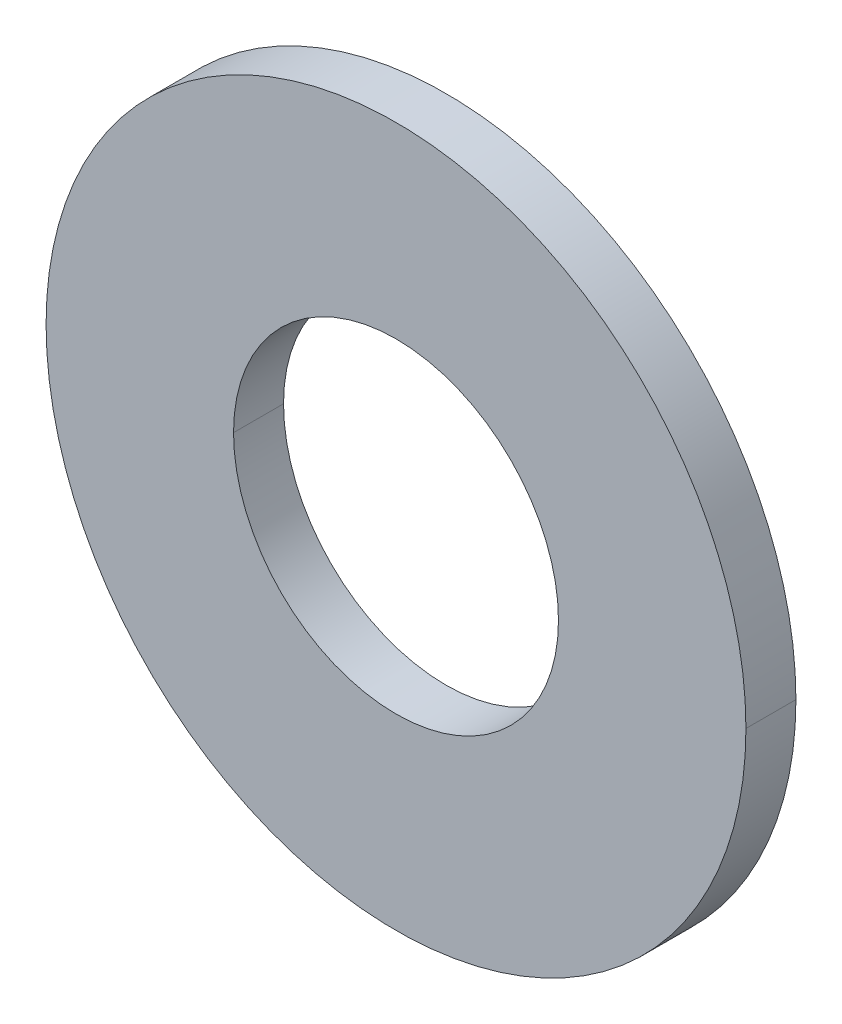
ISO-10303-21;
HEADER;
FILE_DESCRIPTION(('STEP AP214'),'2;1');
FILE_NAME('part.step','',(''),(''),'','','');
FILE_SCHEMA(('AUTOMOTIVE_DESIGN { 1 0 10303 214 1 1 1 1 }'));
ENDSEC;
DATA;
#1=APPLICATION_CONTEXT('core data for automotive mechanical design processes');
#2=APPLICATION_PROTOCOL_DEFINITION('international standard','automotive_design',2000,#1);
#3=PRODUCT_CONTEXT('',#1,'mechanical');
#4=PRODUCT('Part','Part','',(#3));
#5=PRODUCT_RELATED_PRODUCT_CATEGORY('part','',(#4));
#6=PRODUCT_DEFINITION_FORMATION('','',#4);
#7=PRODUCT_DEFINITION_CONTEXT('part definition',#1,'design');
#8=PRODUCT_DEFINITION('design','',#6,#7);
#9=PRODUCT_DEFINITION_SHAPE('','',#8);
#10=(LENGTH_UNIT() NAMED_UNIT(*) SI_UNIT(.MILLI.,.METRE.));
#11=(NAMED_UNIT(*) PLANE_ANGLE_UNIT() SI_UNIT($,.RADIAN.));
#12=(NAMED_UNIT(*) SI_UNIT($,.STERADIAN.) SOLID_ANGLE_UNIT());
#13=UNCERTAINTY_MEASURE_WITH_UNIT(LENGTH_MEASURE(1.E-05),#10,'distance_accuracy_value','');
#14=(GEOMETRIC_REPRESENTATION_CONTEXT(3) GLOBAL_UNCERTAINTY_ASSIGNED_CONTEXT((#13)) GLOBAL_UNIT_ASSIGNED_CONTEXT((#10,
#11,#12)) REPRESENTATION_CONTEXT('',''));
#15=CARTESIAN_POINT('',(0.,0.,0.));
#16=DIRECTION('',(0.,0.,1.));
#17=DIRECTION('',(1.,0.,0.));
#18=AXIS2_PLACEMENT_3D('',#15,#16,#17);
#19=CARTESIAN_POINT('',(0.,0.,0.));
#20=DIRECTION('',(0.,0.,1.));
#21=DIRECTION('',(1.,0.,0.));
#22=AXIS2_PLACEMENT_3D('',#19,#20,#21);
#23=PLANE('',#22);
#24=CARTESIAN_POINT('',(0.,0.,0.));
#25=DIRECTION('',(0.,0.,-1.));
#26=DIRECTION('',(-1.,0.,0.));
#27=AXIS2_PLACEMENT_3D('',#24,#25,#26);
#28=CIRCLE('',#27,3.25);
#29=CARTESIAN_POINT('',(3.25,0.,0.));
#30=VERTEX_POINT('',#29);
#31=CARTESIAN_POINT('',(-3.25,0.,0.));
#32=VERTEX_POINT('',#31);
#33=EDGE_CURVE('E82',#30,#32,#28,.F.);
#34=ORIENTED_EDGE('',*,*,#33,.T.);
#35=CARTESIAN_POINT('',(0.,0.,0.));
#36=DIRECTION('',(0.,0.,-1.));
#37=DIRECTION('',(-1.,0.,0.));
#38=AXIS2_PLACEMENT_3D('',#35,#36,#37);
#39=CIRCLE('',#38,3.25);
#40=EDGE_CURVE('E79',#32,#30,#39,.F.);
#41=ORIENTED_EDGE('',*,*,#40,.T.);
#42=EDGE_LOOP('',(#34,#41));
#43=FACE_BOUND('',#42,.T.);
#44=CARTESIAN_POINT('',(0.,0.,0.));
#45=DIRECTION('',(0.,0.,-1.));
#46=DIRECTION('',(-1.,0.,0.));
#47=AXIS2_PLACEMENT_3D('',#44,#45,#46);
#48=CIRCLE('',#47,7.);
#49=CARTESIAN_POINT('',(-7.,0.,0.));
#50=VERTEX_POINT('',#49);
#51=CARTESIAN_POINT('',(7.,0.,0.));
#52=VERTEX_POINT('',#51);
#53=EDGE_CURVE('E20',#50,#52,#48,.F.);
#54=ORIENTED_EDGE('',*,*,#53,.F.);
#55=CARTESIAN_POINT('',(0.,0.,0.));
#56=DIRECTION('',(0.,0.,-1.));
#57=DIRECTION('',(-1.,0.,0.));
#58=AXIS2_PLACEMENT_3D('',#55,#56,#57);
#59=CIRCLE('',#58,7.);
#60=EDGE_CURVE('E64',#52,#50,#59,.F.);
#61=ORIENTED_EDGE('',*,*,#60,.F.);
#62=EDGE_LOOP('',(#54,#61));
#63=FACE_BOUND('',#62,.T.);
#64=ADVANCED_FACE('F17',(#43,#63),#23,.F.);
#65=CARTESIAN_POINT('',(0.,0.,1.));
#66=DIRECTION('',(0.,0.,-1.));
#67=DIRECTION('',(-1.,0.,0.));
#68=AXIS2_PLACEMENT_3D('',#65,#66,#67);
#69=CYLINDRICAL_SURFACE('',#68,7.);
#70=DIRECTION('',(0.,0.,-1.));
#71=VECTOR('',#70,1.);
#72=CARTESIAN_POINT('',(7.,0.,1.));
#73=LINE('',#72,#71);
#74=CARTESIAN_POINT('',(7.,0.,1.));
#75=VERTEX_POINT('',#74);
#76=EDGE_CURVE('E59',#75,#52,#73,.T.);
#77=ORIENTED_EDGE('',*,*,#76,.F.);
#78=CARTESIAN_POINT('',(0.,0.,1.));
#79=DIRECTION('',(0.,0.,-1.));
#80=DIRECTION('',(-1.,0.,0.));
#81=AXIS2_PLACEMENT_3D('',#78,#79,#80);
#82=CIRCLE('',#81,7.);
#83=CARTESIAN_POINT('',(-7.,0.,1.));
#84=VERTEX_POINT('',#83);
#85=EDGE_CURVE('E77',#84,#75,#82,.F.);
#86=ORIENTED_EDGE('',*,*,#85,.F.);
#87=DIRECTION('',(0.,0.,-1.));
#88=VECTOR('',#87,1.);
#89=CARTESIAN_POINT('',(-7.,0.,1.));
#90=LINE('',#89,#88);
#91=EDGE_CURVE('E62',#50,#84,#90,.F.);
#92=ORIENTED_EDGE('',*,*,#91,.F.);
#93=ORIENTED_EDGE('',*,*,#53,.T.);
#94=EDGE_LOOP('',(#77,#86,#92,#93));
#95=FACE_BOUND('',#94,.T.);
#96=ADVANCED_FACE('F57',(#95),#69,.T.);
#97=CARTESIAN_POINT('',(0.,0.,1.));
#98=DIRECTION('',(0.,0.,-1.));
#99=DIRECTION('',(-1.,0.,0.));
#100=AXIS2_PLACEMENT_3D('',#97,#98,#99);
#101=CYLINDRICAL_SURFACE('',#100,7.);
#102=ORIENTED_EDGE('',*,*,#91,.T.);
#103=CARTESIAN_POINT('',(0.,0.,1.));
#104=DIRECTION('',(0.,0.,-1.));
#105=DIRECTION('',(-1.,0.,0.));
#106=AXIS2_PLACEMENT_3D('',#103,#104,#105);
#107=CIRCLE('',#106,7.);
#108=EDGE_CURVE('E68',#75,#84,#107,.F.);
#109=ORIENTED_EDGE('',*,*,#108,.F.);
#110=ORIENTED_EDGE('',*,*,#76,.T.);
#111=ORIENTED_EDGE('',*,*,#60,.T.);
#112=EDGE_LOOP('',(#102,#109,#110,#111));
#113=FACE_BOUND('',#112,.T.);
#114=ADVANCED_FACE('F66',(#113),#101,.T.);
#115=CARTESIAN_POINT('',(0.,0.,1.));
#116=DIRECTION('',(0.,0.,-1.));
#117=DIRECTION('',(-1.,0.,0.));
#118=AXIS2_PLACEMENT_3D('',#115,#116,#117);
#119=CYLINDRICAL_SURFACE('',#118,3.25);
#120=ORIENTED_EDGE('',*,*,#33,.F.);
#121=DIRECTION('',(0.,0.,-1.));
#122=VECTOR('',#121,1.);
#123=CARTESIAN_POINT('',(3.25,0.,1.));
#124=LINE('',#123,#122);
#125=CARTESIAN_POINT('',(3.25,0.,1.));
#126=VERTEX_POINT('',#125);
#127=EDGE_CURVE('E35',#30,#126,#124,.F.);
#128=ORIENTED_EDGE('',*,*,#127,.T.);
#129=CARTESIAN_POINT('',(0.,0.,1.));
#130=DIRECTION('',(0.,0.,-1.));
#131=DIRECTION('',(-1.,0.,0.));
#132=AXIS2_PLACEMENT_3D('',#129,#130,#131);
#133=CIRCLE('',#132,3.25);
#134=CARTESIAN_POINT('',(-3.25,0.,1.));
#135=VERTEX_POINT('',#134);
#136=EDGE_CURVE('E26',#135,#126,#133,.T.);
#137=ORIENTED_EDGE('',*,*,#136,.F.);
#138=DIRECTION('',(0.,0.,-1.));
#139=VECTOR('',#138,1.);
#140=CARTESIAN_POINT('',(-3.25,0.,1.));
#141=LINE('',#140,#139);
#142=EDGE_CURVE('E81',#135,#32,#141,.T.);
#143=ORIENTED_EDGE('',*,*,#142,.T.);
#144=EDGE_LOOP('',(#120,#128,#137,#143));
#145=FACE_BOUND('',#144,.T.);
#146=ADVANCED_FACE('F95',(#145),#119,.F.);
#147=CARTESIAN_POINT('',(0.,0.,1.));
#148=DIRECTION('',(0.,0.,-1.));
#149=DIRECTION('',(-1.,0.,0.));
#150=AXIS2_PLACEMENT_3D('',#147,#148,#149);
#151=CYLINDRICAL_SURFACE('',#150,3.25);
#152=ORIENTED_EDGE('',*,*,#40,.F.);
#153=ORIENTED_EDGE('',*,*,#142,.F.);
#154=CARTESIAN_POINT('',(0.,0.,1.));
#155=DIRECTION('',(0.,0.,-1.));
#156=DIRECTION('',(-1.,0.,0.));
#157=AXIS2_PLACEMENT_3D('',#154,#155,#156);
#158=CIRCLE('',#157,3.25);
#159=EDGE_CURVE('E11',#126,#135,#158,.T.);
#160=ORIENTED_EDGE('',*,*,#159,.F.);
#161=ORIENTED_EDGE('',*,*,#127,.F.);
#162=EDGE_LOOP('',(#152,#153,#160,#161));
#163=FACE_BOUND('',#162,.T.);
#164=ADVANCED_FACE('F88',(#163),#151,.F.);
#165=CARTESIAN_POINT('',(0.,0.,1.));
#166=DIRECTION('',(0.,0.,1.));
#167=DIRECTION('',(1.,0.,0.));
#168=AXIS2_PLACEMENT_3D('',#165,#166,#167);
#169=PLANE('',#168);
#170=ORIENTED_EDGE('',*,*,#136,.T.);
#171=ORIENTED_EDGE('',*,*,#159,.T.);
#172=EDGE_LOOP('',(#170,#171));
#173=FACE_BOUND('',#172,.T.);
#174=ORIENTED_EDGE('',*,*,#85,.T.);
#175=ORIENTED_EDGE('',*,*,#108,.T.);
#176=EDGE_LOOP('',(#174,#175));
#177=FACE_BOUND('',#176,.T.);
#178=ADVANCED_FACE('F86',(#173,#177),#169,.T.);
#179=CLOSED_SHELL('',(#64,#96,#114,#146,#164,#178));
#180=MANIFOLD_SOLID_BREP('B1',#179);
#181=ADVANCED_BREP_SHAPE_REPRESENTATION('',(#18,#180),#14);
#182=SHAPE_DEFINITION_REPRESENTATION(#9,#181);
ENDSEC;
END-ISO-10303-21;
